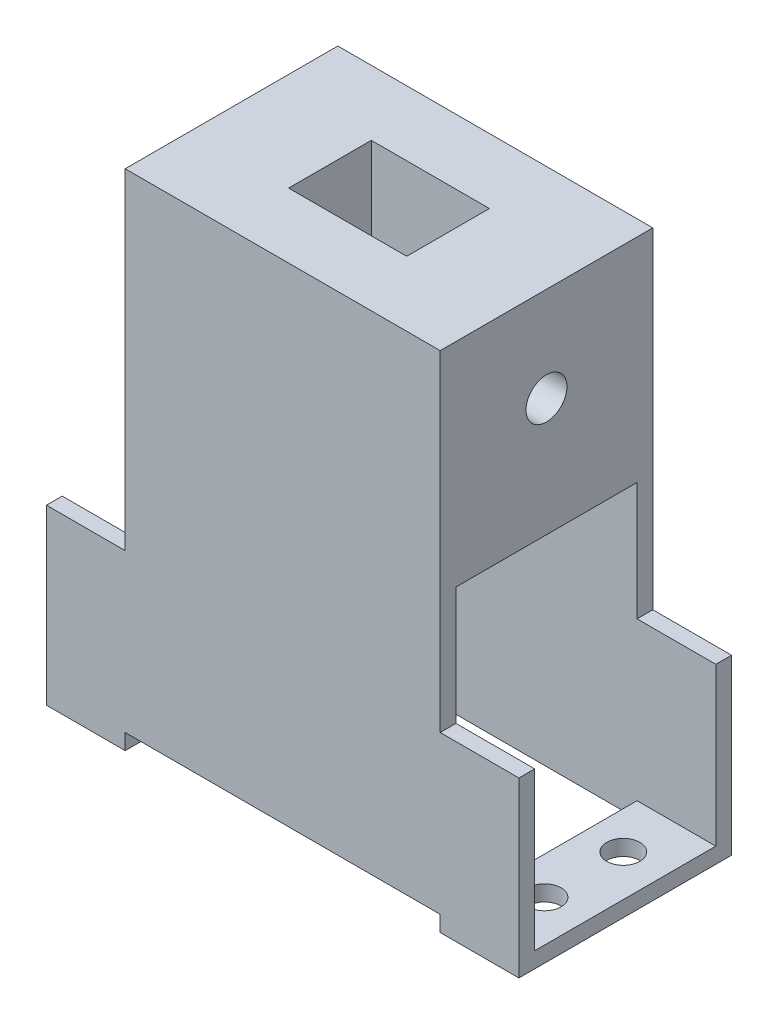
ISO-10303-21;
HEADER;
FILE_DESCRIPTION(('STEP AP214'),'2;1');
FILE_NAME('part.step','',(''),(''),'','','');
FILE_SCHEMA(('AUTOMOTIVE_DESIGN { 1 0 10303 214 1 1 1 1 }'));
ENDSEC;
DATA;
#1=APPLICATION_CONTEXT('core data for automotive mechanical design processes');
#2=APPLICATION_PROTOCOL_DEFINITION('international standard','automotive_design',2000,#1);
#3=PRODUCT_CONTEXT('',#1,'mechanical');
#4=PRODUCT('Part','Part','',(#3));
#5=PRODUCT_RELATED_PRODUCT_CATEGORY('part','',(#4));
#6=PRODUCT_DEFINITION_FORMATION('','',#4);
#7=PRODUCT_DEFINITION_CONTEXT('part definition',#1,'design');
#8=PRODUCT_DEFINITION('design','',#6,#7);
#9=PRODUCT_DEFINITION_SHAPE('','',#8);
#10=(LENGTH_UNIT() NAMED_UNIT(*) SI_UNIT(.MILLI.,.METRE.));
#11=(NAMED_UNIT(*) PLANE_ANGLE_UNIT() SI_UNIT($,.RADIAN.));
#12=(NAMED_UNIT(*) SI_UNIT($,.STERADIAN.) SOLID_ANGLE_UNIT());
#13=UNCERTAINTY_MEASURE_WITH_UNIT(LENGTH_MEASURE(1.E-05),#10,'distance_accuracy_value','');
#14=(GEOMETRIC_REPRESENTATION_CONTEXT(3) GLOBAL_UNCERTAINTY_ASSIGNED_CONTEXT((#13)) GLOBAL_UNIT_ASSIGNED_CONTEXT((#10,
#11,#12)) REPRESENTATION_CONTEXT('',''));
#15=CARTESIAN_POINT('',(0.,0.,0.));
#16=DIRECTION('',(0.,0.,1.));
#17=DIRECTION('',(1.,0.,0.));
#18=AXIS2_PLACEMENT_3D('',#15,#16,#17);
#19=CARTESIAN_POINT('',(30.001,32.5,-11.5));
#20=DIRECTION('',(-1.,0.,0.));
#21=DIRECTION('',(0.,0.,1.));
#22=AXIS2_PLACEMENT_3D('',#19,#20,#21);
#23=CYLINDRICAL_SURFACE('',#22,2.6);
#24=CARTESIAN_POINT('',(7.5,32.5,-11.5));
#25=DIRECTION('',(1.,0.,0.));
#26=DIRECTION('',(0.,0.,-1.));
#27=AXIS2_PLACEMENT_3D('',#24,#25,#26);
#28=CIRCLE('',#27,2.6);
#29=CARTESIAN_POINT('',(7.5,32.5,-14.1));
#30=VERTEX_POINT('',#29);
#31=EDGE_CURVE('E47',#30,#30,#28,.F.);
#32=ORIENTED_EDGE('',*,*,#31,.T.);
#33=EDGE_LOOP('',(#32));
#34=FACE_BOUND('',#33,.T.);
#35=CARTESIAN_POINT('',(20.,32.5,-11.5));
#36=DIRECTION('',(-1.,0.,0.));
#37=DIRECTION('',(0.,-1.,0.));
#38=AXIS2_PLACEMENT_3D('',#35,#36,#37);
#39=CIRCLE('',#38,2.6);
#40=CARTESIAN_POINT('',(20.,29.9,-11.5));
#41=VERTEX_POINT('',#40);
#42=EDGE_CURVE('E257',#41,#41,#39,.F.);
#43=ORIENTED_EDGE('',*,*,#42,.T.);
#44=EDGE_LOOP('',(#43));
#45=FACE_BOUND('',#44,.T.);
#46=ADVANCED_FACE('F43',(#34,#45),#23,.F.);
#47=CARTESIAN_POINT('',(0.,-17.5,2.));
#48=DIRECTION('',(0.,-1.,0.));
#49=DIRECTION('',(0.,0.,-1.));
#50=AXIS2_PLACEMENT_3D('',#47,#48,#49);
#51=PLANE('',#50);
#52=DIRECTION('',(-1.,0.,0.));
#53=VECTOR('',#52,1.);
#54=CARTESIAN_POINT('',(0.,-17.5,0.));
#55=LINE('',#54,#53);
#56=CARTESIAN_POINT('',(20.,-17.5,0.));
#57=VERTEX_POINT('',#56);
#58=CARTESIAN_POINT('',(-20.,-17.5,0.));
#59=VERTEX_POINT('',#58);
#60=EDGE_CURVE('E420',#57,#59,#55,.T.);
#61=ORIENTED_EDGE('',*,*,#60,.F.);
#62=DIRECTION('',(0.,0.,-1.));
#63=VECTOR('',#62,1.);
#64=CARTESIAN_POINT('',(20.,-17.5,2.));
#65=LINE('',#64,#63);
#66=CARTESIAN_POINT('',(20.,-17.5,2.));
#67=VERTEX_POINT('',#66);
#68=EDGE_CURVE('E69',#67,#57,#65,.T.);
#69=ORIENTED_EDGE('',*,*,#68,.F.);
#70=DIRECTION('',(-1.,0.,0.));
#71=VECTOR('',#70,1.);
#72=CARTESIAN_POINT('',(0.,-17.5,2.));
#73=LINE('',#72,#71);
#74=CARTESIAN_POINT('',(-20.,-17.5,2.));
#75=VERTEX_POINT('',#74);
#76=EDGE_CURVE('E398',#67,#75,#73,.T.);
#77=ORIENTED_EDGE('',*,*,#76,.T.);
#78=DIRECTION('',(0.,0.,1.));
#79=VECTOR('',#78,1.);
#80=CARTESIAN_POINT('',(-20.,-17.5,-23.));
#81=LINE('',#80,#79);
#82=EDGE_CURVE('E11',#59,#75,#81,.T.);
#83=ORIENTED_EDGE('',*,*,#82,.F.);
#84=EDGE_LOOP('',(#61,#69,#77,#83));
#85=FACE_BOUND('',#84,.T.);
#86=ADVANCED_FACE('F461',(#85),#51,.T.);
#87=CARTESIAN_POINT('',(0.,2.5,2.));
#88=DIRECTION('',(0.,1.,0.));
#89=DIRECTION('',(-1.,0.,0.));
#90=AXIS2_PLACEMENT_3D('',#87,#88,#89);
#91=PLANE('',#90);
#92=DIRECTION('',(1.,0.,0.));
#93=VECTOR('',#92,1.);
#94=CARTESIAN_POINT('',(0.,2.5,0.));
#95=LINE('',#94,#93);
#96=CARTESIAN_POINT('',(-30.,2.5,0.));
#97=VERTEX_POINT('',#96);
#98=CARTESIAN_POINT('',(-20.,2.5,0.));
#99=VERTEX_POINT('',#98);
#100=EDGE_CURVE('E390',#97,#99,#95,.T.);
#101=ORIENTED_EDGE('',*,*,#100,.F.);
#102=DIRECTION('',(0.,0.,-1.));
#103=VECTOR('',#102,1.);
#104=CARTESIAN_POINT('',(-30.,2.5,2.));
#105=LINE('',#104,#103);
#106=CARTESIAN_POINT('',(-30.,2.5,2.));
#107=VERTEX_POINT('',#106);
#108=EDGE_CURVE('E52',#107,#97,#105,.T.);
#109=ORIENTED_EDGE('',*,*,#108,.F.);
#110=DIRECTION('',(1.,0.,0.));
#111=VECTOR('',#110,1.);
#112=CARTESIAN_POINT('',(0.,2.5,2.));
#113=LINE('',#112,#111);
#114=CARTESIAN_POINT('',(-20.,2.5,2.));
#115=VERTEX_POINT('',#114);
#116=EDGE_CURVE('E391',#107,#115,#113,.T.);
#117=ORIENTED_EDGE('',*,*,#116,.T.);
#118=DIRECTION('',(0.,0.,-1.));
#119=VECTOR('',#118,1.);
#120=CARTESIAN_POINT('',(-20.,2.5,2.));
#121=LINE('',#120,#119);
#122=EDGE_CURVE('E409',#115,#99,#121,.T.);
#123=ORIENTED_EDGE('',*,*,#122,.T.);
#124=EDGE_LOOP('',(#101,#109,#117,#123));
#125=FACE_BOUND('',#124,.T.);
#126=ADVANCED_FACE('F45',(#125),#91,.T.);
#127=CARTESIAN_POINT('',(-30.,0.,2.));
#128=DIRECTION('',(-1.,0.,0.));
#129=DIRECTION('',(0.,0.,1.));
#130=AXIS2_PLACEMENT_3D('',#127,#128,#129);
#131=PLANE('',#130);
#132=DIRECTION('',(0.,1.,0.));
#133=VECTOR('',#132,1.);
#134=CARTESIAN_POINT('',(-30.,0.,0.));
#135=LINE('',#134,#133);
#136=CARTESIAN_POINT('',(-30.,-17.5,0.));
#137=VERTEX_POINT('',#136);
#138=EDGE_CURVE('E412',#137,#97,#135,.T.);
#139=ORIENTED_EDGE('',*,*,#138,.F.);
#140=DIRECTION('',(0.,0.,-1.));
#141=VECTOR('',#140,1.);
#142=CARTESIAN_POINT('',(-30.,-17.5,2.));
#143=LINE('',#142,#141);
#144=CARTESIAN_POINT('',(-30.,-17.5,-23.));
#145=VERTEX_POINT('',#144);
#146=EDGE_CURVE('E365',#137,#145,#143,.T.);
#147=ORIENTED_EDGE('',*,*,#146,.T.);
#148=DIRECTION('',(0.,1.,0.));
#149=VECTOR('',#148,1.);
#150=CARTESIAN_POINT('',(-30.,-19.5,-23.));
#151=LINE('',#150,#149);
#152=CARTESIAN_POINT('',(-30.,2.5,-23.));
#153=VERTEX_POINT('',#152);
#154=EDGE_CURVE('E307',#145,#153,#151,.T.);
#155=ORIENTED_EDGE('',*,*,#154,.T.);
#156=DIRECTION('',(0.,0.,1.));
#157=VECTOR('',#156,1.);
#158=CARTESIAN_POINT('',(-30.,2.5,-25.));
#159=LINE('',#158,#157);
#160=CARTESIAN_POINT('',(-30.,2.5,-25.));
#161=VERTEX_POINT('',#160);
#162=EDGE_CURVE('E348',#161,#153,#159,.T.);
#163=ORIENTED_EDGE('',*,*,#162,.F.);
#164=DIRECTION('',(0.,1.,0.));
#165=VECTOR('',#164,1.);
#166=CARTESIAN_POINT('',(-30.,-17.5,-25.));
#167=LINE('',#166,#165);
#168=CARTESIAN_POINT('',(-30.,-19.5,-25.));
#169=VERTEX_POINT('',#168);
#170=EDGE_CURVE('E303',#169,#161,#167,.T.);
#171=ORIENTED_EDGE('',*,*,#170,.F.);
#172=DIRECTION('',(0.,0.,-1.));
#173=VECTOR('',#172,1.);
#174=CARTESIAN_POINT('',(-30.,-19.5,2.));
#175=LINE('',#174,#173);
#176=CARTESIAN_POINT('',(-30.,-19.5,2.));
#177=VERTEX_POINT('',#176);
#178=EDGE_CURVE('E375',#177,#169,#175,.T.);
#179=ORIENTED_EDGE('',*,*,#178,.F.);
#180=DIRECTION('',(0.,1.,0.));
#181=VECTOR('',#180,1.);
#182=CARTESIAN_POINT('',(-30.,0.,2.));
#183=LINE('',#182,#181);
#184=EDGE_CURVE('E394',#177,#107,#183,.T.);
#185=ORIENTED_EDGE('',*,*,#184,.T.);
#186=ORIENTED_EDGE('',*,*,#108,.T.);
#187=EDGE_LOOP('',(#139,#147,#155,#163,#171,#179,#185,#186));
#188=FACE_BOUND('',#187,.T.);
#189=ADVANCED_FACE('F548',(#188),#131,.T.);
#190=CARTESIAN_POINT('',(30.,0.,2.));
#191=DIRECTION('',(1.,0.,0.));
#192=DIRECTION('',(0.,1.,0.));
#193=AXIS2_PLACEMENT_3D('',#190,#191,#192);
#194=PLANE('',#193);
#195=DIRECTION('',(0.,-1.,0.));
#196=VECTOR('',#195,1.);
#197=CARTESIAN_POINT('',(30.,0.,0.));
#198=LINE('',#197,#196);
#199=CARTESIAN_POINT('',(30.,2.50000000000001,0.));
#200=VERTEX_POINT('',#199);
#201=CARTESIAN_POINT('',(30.,-17.5,0.));
#202=VERTEX_POINT('',#201);
#203=EDGE_CURVE('E419',#200,#202,#198,.T.);
#204=ORIENTED_EDGE('',*,*,#203,.F.);
#205=DIRECTION('',(0.,0.,-1.));
#206=VECTOR('',#205,1.);
#207=CARTESIAN_POINT('',(30.,2.50000000000001,2.));
#208=LINE('',#207,#206);
#209=CARTESIAN_POINT('',(30.,2.50000000000001,2.));
#210=VERTEX_POINT('',#209);
#211=EDGE_CURVE('E437',#210,#200,#208,.T.);
#212=ORIENTED_EDGE('',*,*,#211,.F.);
#213=DIRECTION('',(0.,-1.,0.));
#214=VECTOR('',#213,1.);
#215=CARTESIAN_POINT('',(30.,0.,2.));
#216=LINE('',#215,#214);
#217=CARTESIAN_POINT('',(30.,-19.5,2.));
#218=VERTEX_POINT('',#217);
#219=EDGE_CURVE('E400',#210,#218,#216,.T.);
#220=ORIENTED_EDGE('',*,*,#219,.T.);
#221=DIRECTION('',(0.,0.,1.));
#222=VECTOR('',#221,1.);
#223=CARTESIAN_POINT('',(30.,-19.5,-23.));
#224=LINE('',#223,#222);
#225=CARTESIAN_POINT('',(30.,-19.5,-25.));
#226=VERTEX_POINT('',#225);
#227=EDGE_CURVE('E369',#226,#218,#224,.T.);
#228=ORIENTED_EDGE('',*,*,#227,.F.);
#229=DIRECTION('',(0.,-1.,0.));
#230=VECTOR('',#229,1.);
#231=CARTESIAN_POINT('',(30.,2.50000000000001,-25.));
#232=LINE('',#231,#230);
#233=CARTESIAN_POINT('',(30.,2.50000000000001,-25.));
#234=VERTEX_POINT('',#233);
#235=EDGE_CURVE('E315',#234,#226,#232,.T.);
#236=ORIENTED_EDGE('',*,*,#235,.F.);
#237=DIRECTION('',(0.,0.,1.));
#238=VECTOR('',#237,1.);
#239=CARTESIAN_POINT('',(30.,2.50000000000001,-25.));
#240=LINE('',#239,#238);
#241=CARTESIAN_POINT('',(30.,2.50000000000001,-23.));
#242=VERTEX_POINT('',#241);
#243=EDGE_CURVE('E321',#234,#242,#240,.T.);
#244=ORIENTED_EDGE('',*,*,#243,.T.);
#245=DIRECTION('',(0.,-1.,0.));
#246=VECTOR('',#245,1.);
#247=CARTESIAN_POINT('',(30.,-19.5,-23.));
#248=LINE('',#247,#246);
#249=CARTESIAN_POINT('',(30.,-17.5,-23.));
#250=VERTEX_POINT('',#249);
#251=EDGE_CURVE('E333',#242,#250,#248,.T.);
#252=ORIENTED_EDGE('',*,*,#251,.T.);
#253=DIRECTION('',(0.,0.,1.));
#254=VECTOR('',#253,1.);
#255=CARTESIAN_POINT('',(30.,-17.5,-23.));
#256=LINE('',#255,#254);
#257=EDGE_CURVE('E358',#250,#202,#256,.T.);
#258=ORIENTED_EDGE('',*,*,#257,.T.);
#259=EDGE_LOOP('',(#204,#212,#220,#228,#236,#244,#252,#258));
#260=FACE_BOUND('',#259,.T.);
#261=ADVANCED_FACE('F545',(#260),#194,.T.);
#262=CARTESIAN_POINT('',(0.,2.5,2.));
#263=DIRECTION('',(0.,1.,0.));
#264=DIRECTION('',(-1.,0.,0.));
#265=AXIS2_PLACEMENT_3D('',#262,#263,#264);
#266=PLANE('',#265);
#267=DIRECTION('',(1.,0.,0.));
#268=VECTOR('',#267,1.);
#269=CARTESIAN_POINT('',(0.,2.5,0.));
#270=LINE('',#269,#268);
#271=CARTESIAN_POINT('',(20.,2.5,0.));
#272=VERTEX_POINT('',#271);
#273=EDGE_CURVE('E423',#272,#200,#270,.T.);
#274=ORIENTED_EDGE('',*,*,#273,.F.);
#275=DIRECTION('',(0.,0.,-1.));
#276=VECTOR('',#275,1.);
#277=CARTESIAN_POINT('',(20.,2.5,2.));
#278=LINE('',#277,#276);
#279=CARTESIAN_POINT('',(20.,2.5,2.));
#280=VERTEX_POINT('',#279);
#281=EDGE_CURVE('E435',#280,#272,#278,.T.);
#282=ORIENTED_EDGE('',*,*,#281,.F.);
#283=DIRECTION('',(1.,0.,0.));
#284=VECTOR('',#283,1.);
#285=CARTESIAN_POINT('',(0.,2.5,2.));
#286=LINE('',#285,#284);
#287=EDGE_CURVE('E402',#280,#210,#286,.T.);
#288=ORIENTED_EDGE('',*,*,#287,.T.);
#289=ORIENTED_EDGE('',*,*,#211,.T.);
#290=EDGE_LOOP('',(#274,#282,#288,#289));
#291=FACE_BOUND('',#290,.T.);
#292=ADVANCED_FACE('F541',(#291),#266,.T.);
#293=CARTESIAN_POINT('',(20.,0.,2.));
#294=DIRECTION('',(-1.,0.,0.));
#295=DIRECTION('',(0.,-1.,0.));
#296=AXIS2_PLACEMENT_3D('',#293,#294,#295);
#297=PLANE('',#296);
#298=ORIENTED_EDGE('',*,*,#42,.F.);
#299=EDGE_LOOP('',(#298));
#300=FACE_BOUND('',#299,.T.);
#301=DIRECTION('',(0.,1.,0.));
#302=VECTOR('',#301,1.);
#303=CARTESIAN_POINT('',(20.,0.,0.));
#304=LINE('',#303,#302);
#305=CARTESIAN_POINT('',(20.,17.5,0.));
#306=VERTEX_POINT('',#305);
#307=EDGE_CURVE('E426',#272,#306,#304,.T.);
#308=ORIENTED_EDGE('',*,*,#307,.T.);
#309=DIRECTION('',(0.,0.,-1.));
#310=VECTOR('',#309,1.);
#311=CARTESIAN_POINT('',(20.,17.5,2.));
#312=LINE('',#311,#310);
#313=CARTESIAN_POINT('',(20.,17.5,-23.));
#314=VERTEX_POINT('',#313);
#315=EDGE_CURVE('E275',#306,#314,#312,.T.);
#316=ORIENTED_EDGE('',*,*,#315,.T.);
#317=DIRECTION('',(0.,-1.,0.));
#318=VECTOR('',#317,1.);
#319=CARTESIAN_POINT('',(20.,17.5,-23.));
#320=LINE('',#319,#318);
#321=CARTESIAN_POINT('',(20.,2.5,-23.));
#322=VERTEX_POINT('',#321);
#323=EDGE_CURVE('E328',#314,#322,#320,.T.);
#324=ORIENTED_EDGE('',*,*,#323,.T.);
#325=DIRECTION('',(0.,0.,1.));
#326=VECTOR('',#325,1.);
#327=CARTESIAN_POINT('',(20.,2.5,-25.));
#328=LINE('',#327,#326);
#329=CARTESIAN_POINT('',(20.,2.5,-25.));
#330=VERTEX_POINT('',#329);
#331=EDGE_CURVE('E342',#330,#322,#328,.T.);
#332=ORIENTED_EDGE('',*,*,#331,.F.);
#333=DIRECTION('',(0.,-1.,0.));
#334=VECTOR('',#333,1.);
#335=CARTESIAN_POINT('',(20.,17.5,-25.));
#336=LINE('',#335,#334);
#337=CARTESIAN_POINT('',(20.,44.5,-25.));
#338=VERTEX_POINT('',#337);
#339=EDGE_CURVE('E311',#338,#330,#336,.T.);
#340=ORIENTED_EDGE('',*,*,#339,.F.);
#341=DIRECTION('',(0.,0.,-1.));
#342=VECTOR('',#341,1.);
#343=CARTESIAN_POINT('',(20.,44.5,2.));
#344=LINE('',#343,#342);
#345=CARTESIAN_POINT('',(20.,44.5,2.));
#346=VERTEX_POINT('',#345);
#347=EDGE_CURVE('E263',#346,#338,#344,.T.);
#348=ORIENTED_EDGE('',*,*,#347,.F.);
#349=DIRECTION('',(0.,1.,0.));
#350=VECTOR('',#349,1.);
#351=CARTESIAN_POINT('',(20.,0.,2.));
#352=LINE('',#351,#350);
#353=EDGE_CURVE('E405',#280,#346,#352,.T.);
#354=ORIENTED_EDGE('',*,*,#353,.F.);
#355=ORIENTED_EDGE('',*,*,#281,.T.);
#356=EDGE_LOOP('',(#308,#316,#324,#332,#340,#348,#354,#355));
#357=FACE_BOUND('',#356,.T.);
#358=ADVANCED_FACE('F537',(#300,#357),#297,.F.);
#359=CARTESIAN_POINT('',(-20.,0.,2.));
#360=DIRECTION('',(-1.,0.,0.));
#361=DIRECTION('',(0.,0.,1.));
#362=AXIS2_PLACEMENT_3D('',#359,#360,#361);
#363=PLANE('',#362);
#364=CARTESIAN_POINT('',(-20.,32.5,-11.5));
#365=DIRECTION('',(-1.,0.,0.));
#366=DIRECTION('',(0.,0.,1.));
#367=AXIS2_PLACEMENT_3D('',#364,#365,#366);
#368=CIRCLE('',#367,2.6);
#369=CARTESIAN_POINT('',(-20.,32.5,-8.90000000000001));
#370=VERTEX_POINT('',#369);
#371=EDGE_CURVE('E254',#370,#370,#368,.T.);
#372=ORIENTED_EDGE('',*,*,#371,.F.);
#373=EDGE_LOOP('',(#372));
#374=FACE_BOUND('',#373,.T.);
#375=DIRECTION('',(0.,1.,0.));
#376=VECTOR('',#375,1.);
#377=CARTESIAN_POINT('',(-20.,0.,0.));
#378=LINE('',#377,#376);
#379=CARTESIAN_POINT('',(-20.,17.5,0.));
#380=VERTEX_POINT('',#379);
#381=EDGE_CURVE('E395',#99,#380,#378,.T.);
#382=ORIENTED_EDGE('',*,*,#381,.F.);
#383=ORIENTED_EDGE('',*,*,#122,.F.);
#384=DIRECTION('',(0.,1.,0.));
#385=VECTOR('',#384,1.);
#386=CARTESIAN_POINT('',(-20.,0.,2.));
#387=LINE('',#386,#385);
#388=CARTESIAN_POINT('',(-20.,44.5,2.));
#389=VERTEX_POINT('',#388);
#390=EDGE_CURVE('E407',#115,#389,#387,.T.);
#391=ORIENTED_EDGE('',*,*,#390,.T.);
#392=DIRECTION('',(0.,0.,1.));
#393=VECTOR('',#392,1.);
#394=CARTESIAN_POINT('',(-20.,44.5,-25.));
#395=LINE('',#394,#393);
#396=CARTESIAN_POINT('',(-20.,44.5,-25.));
#397=VERTEX_POINT('',#396);
#398=EDGE_CURVE('E269',#397,#389,#395,.T.);
#399=ORIENTED_EDGE('',*,*,#398,.F.);
#400=DIRECTION('',(0.,1.,0.));
#401=VECTOR('',#400,1.);
#402=CARTESIAN_POINT('',(-20.,2.5,-25.));
#403=LINE('',#402,#401);
#404=CARTESIAN_POINT('',(-20.,2.5,-25.));
#405=VERTEX_POINT('',#404);
#406=EDGE_CURVE('E309',#405,#397,#403,.T.);
#407=ORIENTED_EDGE('',*,*,#406,.F.);
#408=DIRECTION('',(0.,0.,1.));
#409=VECTOR('',#408,1.);
#410=CARTESIAN_POINT('',(-20.,2.5,-25.));
#411=LINE('',#410,#409);
#412=CARTESIAN_POINT('',(-20.,2.5,-23.));
#413=VERTEX_POINT('',#412);
#414=EDGE_CURVE('E345',#405,#413,#411,.T.);
#415=ORIENTED_EDGE('',*,*,#414,.T.);
#416=DIRECTION('',(0.,1.,0.));
#417=VECTOR('',#416,1.);
#418=CARTESIAN_POINT('',(-20.,2.5,-23.));
#419=LINE('',#418,#417);
#420=CARTESIAN_POINT('',(-20.,17.5,-23.));
#421=VERTEX_POINT('',#420);
#422=EDGE_CURVE('E323',#413,#421,#419,.T.);
#423=ORIENTED_EDGE('',*,*,#422,.T.);
#424=DIRECTION('',(0.,0.,1.));
#425=VECTOR('',#424,1.);
#426=CARTESIAN_POINT('',(-20.,17.5,0.));
#427=LINE('',#426,#425);
#428=EDGE_CURVE('E272',#421,#380,#427,.T.);
#429=ORIENTED_EDGE('',*,*,#428,.T.);
#430=EDGE_LOOP('',(#382,#383,#391,#399,#407,#415,#423,#429));
#431=FACE_BOUND('',#430,.T.);
#432=ADVANCED_FACE('F530',(#374,#431),#363,.T.);
#433=CARTESIAN_POINT('',(0.,0.,2.));
#434=DIRECTION('',(0.,0.,1.));
#435=DIRECTION('',(1.,0.,0.));
#436=AXIS2_PLACEMENT_3D('',#433,#434,#435);
#437=PLANE('',#436);
#438=ORIENTED_EDGE('',*,*,#116,.F.);
#439=ORIENTED_EDGE('',*,*,#184,.F.);
#440=DIRECTION('',(-1.,0.,0.));
#441=VECTOR('',#440,1.);
#442=CARTESIAN_POINT('',(-20.,-19.5,2.));
#443=LINE('',#442,#441);
#444=CARTESIAN_POINT('',(-20.,-19.5,2.));
#445=VERTEX_POINT('',#444);
#446=EDGE_CURVE('E372',#445,#177,#443,.T.);
#447=ORIENTED_EDGE('',*,*,#446,.F.);
#448=DIRECTION('',(0.,1.,0.));
#449=VECTOR('',#448,1.);
#450=CARTESIAN_POINT('',(-20.,-19.5,2.));
#451=LINE('',#450,#449);
#452=EDGE_CURVE('E379',#445,#75,#451,.T.);
#453=ORIENTED_EDGE('',*,*,#452,.T.);
#454=ORIENTED_EDGE('',*,*,#76,.F.);
#455=DIRECTION('',(0.,1.,0.));
#456=VECTOR('',#455,1.);
#457=CARTESIAN_POINT('',(20.,-19.5,2.));
#458=LINE('',#457,#456);
#459=CARTESIAN_POINT('',(20.,-19.5,2.));
#460=VERTEX_POINT('',#459);
#461=EDGE_CURVE('E351',#460,#67,#458,.T.);
#462=ORIENTED_EDGE('',*,*,#461,.F.);
#463=DIRECTION('',(-1.,0.,0.));
#464=VECTOR('',#463,1.);
#465=CARTESIAN_POINT('',(30.,-19.5,2.));
#466=LINE('',#465,#464);
#467=EDGE_CURVE('E367',#218,#460,#466,.T.);
#468=ORIENTED_EDGE('',*,*,#467,.F.);
#469=ORIENTED_EDGE('',*,*,#219,.F.);
#470=ORIENTED_EDGE('',*,*,#287,.F.);
#471=ORIENTED_EDGE('',*,*,#353,.T.);
#472=DIRECTION('',(1.,0.,0.));
#473=VECTOR('',#472,1.);
#474=CARTESIAN_POINT('',(-20.,44.5,2.));
#475=LINE('',#474,#473);
#476=EDGE_CURVE('E260',#389,#346,#475,.T.);
#477=ORIENTED_EDGE('',*,*,#476,.F.);
#478=ORIENTED_EDGE('',*,*,#390,.F.);
#479=EDGE_LOOP('',(#438,#439,#447,#453,#454,#462,#468,#469,#470,#471,#477,#478));
#480=FACE_BOUND('',#479,.T.);
#481=ADVANCED_FACE('F527',(#480),#437,.T.);
#482=CARTESIAN_POINT('',(0.,0.,0.));
#483=DIRECTION('',(0.,0.,1.));
#484=DIRECTION('',(1.,0.,0.));
#485=AXIS2_PLACEMENT_3D('',#482,#483,#484);
#486=PLANE('',#485);
#487=ORIENTED_EDGE('',*,*,#100,.T.);
#488=ORIENTED_EDGE('',*,*,#381,.T.);
#489=DIRECTION('',(1.,0.,0.));
#490=VECTOR('',#489,1.);
#491=CARTESIAN_POINT('',(0.,17.5,0.));
#492=LINE('',#491,#490);
#493=EDGE_CURVE('E429',#380,#306,#492,.T.);
#494=ORIENTED_EDGE('',*,*,#493,.T.);
#495=ORIENTED_EDGE('',*,*,#307,.F.);
#496=ORIENTED_EDGE('',*,*,#273,.T.);
#497=ORIENTED_EDGE('',*,*,#203,.T.);
#498=EDGE_CURVE('E416',#202,#57,#55,.T.);
#499=ORIENTED_EDGE('',*,*,#498,.T.);
#500=ORIENTED_EDGE('',*,*,#60,.T.);
#501=EDGE_CURVE('E415',#59,#137,#55,.T.);
#502=ORIENTED_EDGE('',*,*,#501,.T.);
#503=ORIENTED_EDGE('',*,*,#138,.T.);
#504=EDGE_LOOP('',(#487,#488,#494,#495,#496,#497,#499,#500,#502,#503));
#505=FACE_BOUND('',#504,.T.);
#506=ADVANCED_FACE('F525',(#505),#486,.F.);
#507=CARTESIAN_POINT('',(-20.,-19.5,-23.));
#508=DIRECTION('',(-1.,0.,0.));
#509=DIRECTION('',(0.,-1.,0.));
#510=AXIS2_PLACEMENT_3D('',#507,#508,#509);
#511=PLANE('',#510);
#512=CARTESIAN_POINT('',(-20.,-17.5,-23.));
#513=VERTEX_POINT('',#512);
#514=EDGE_CURVE('E54',#513,#59,#81,.T.);
#515=ORIENTED_EDGE('',*,*,#514,.T.);
#516=ORIENTED_EDGE('',*,*,#82,.T.);
#517=ORIENTED_EDGE('',*,*,#452,.F.);
#518=DIRECTION('',(0.,0.,1.));
#519=VECTOR('',#518,1.);
#520=CARTESIAN_POINT('',(-20.,-19.5,-23.));
#521=LINE('',#520,#519);
#522=CARTESIAN_POINT('',(-20.,-19.5,-23.));
#523=VERTEX_POINT('',#522);
#524=EDGE_CURVE('E377',#523,#445,#521,.T.);
#525=ORIENTED_EDGE('',*,*,#524,.F.);
#526=DIRECTION('',(0.,1.,0.));
#527=VECTOR('',#526,1.);
#528=CARTESIAN_POINT('',(-20.,-19.5,-23.));
#529=LINE('',#528,#527);
#530=EDGE_CURVE('E387',#523,#513,#529,.T.);
#531=ORIENTED_EDGE('',*,*,#530,.T.);
#532=EDGE_LOOP('',(#515,#516,#517,#525,#531));
#533=FACE_BOUND('',#532,.T.);
#534=ADVANCED_FACE('F518',(#533),#511,.F.);
#535=CARTESIAN_POINT('',(0.,-19.5,0.));
#536=DIRECTION('',(0.,-1.,0.));
#537=DIRECTION('',(1.,0.,0.));
#538=AXIS2_PLACEMENT_3D('',#535,#536,#537);
#539=PLANE('',#538);
#540=CARTESIAN_POINT('',(24.75,-19.5,-6.5));
#541=DIRECTION('',(0.,-1.,0.));
#542=DIRECTION('',(1.,0.,0.));
#543=AXIS2_PLACEMENT_3D('',#540,#541,#542);
#544=CIRCLE('',#543,2.1);
#545=CARTESIAN_POINT('',(26.85,-19.5,-6.5));
#546=VERTEX_POINT('',#545);
#547=EDGE_CURVE('E285',#546,#546,#544,.F.);
#548=ORIENTED_EDGE('',*,*,#547,.T.);
#549=EDGE_LOOP('',(#548));
#550=FACE_BOUND('',#549,.T.);
#551=CARTESIAN_POINT('',(-24.75,-19.5,-16.5));
#552=DIRECTION('',(0.,-1.,0.));
#553=DIRECTION('',(1.,0.,0.));
#554=AXIS2_PLACEMENT_3D('',#551,#552,#553);
#555=CIRCLE('',#554,2.1);
#556=CARTESIAN_POINT('',(-22.65,-19.5,-16.5));
#557=VERTEX_POINT('',#556);
#558=EDGE_CURVE('E292',#557,#557,#555,.F.);
#559=ORIENTED_EDGE('',*,*,#558,.T.);
#560=EDGE_LOOP('',(#559));
#561=FACE_BOUND('',#560,.T.);
#562=CARTESIAN_POINT('',(-24.75,-19.5,-6.49999999999999));
#563=DIRECTION('',(0.,-1.,0.));
#564=DIRECTION('',(1.,0.,0.));
#565=AXIS2_PLACEMENT_3D('',#562,#563,#564);
#566=CIRCLE('',#565,2.1);
#567=CARTESIAN_POINT('',(-22.65,-19.5,-6.49999999999999));
#568=VERTEX_POINT('',#567);
#569=EDGE_CURVE('E279',#568,#568,#566,.F.);
#570=ORIENTED_EDGE('',*,*,#569,.T.);
#571=EDGE_LOOP('',(#570));
#572=FACE_BOUND('',#571,.T.);
#573=CARTESIAN_POINT('',(24.75,-19.5,-16.5));
#574=DIRECTION('',(0.,-1.,0.));
#575=DIRECTION('',(1.,0.,0.));
#576=AXIS2_PLACEMENT_3D('',#573,#574,#575);
#577=CIRCLE('',#576,2.1);
#578=CARTESIAN_POINT('',(26.85,-19.5,-16.5));
#579=VERTEX_POINT('',#578);
#580=EDGE_CURVE('E288',#579,#579,#577,.F.);
#581=ORIENTED_EDGE('',*,*,#580,.T.);
#582=EDGE_LOOP('',(#581));
#583=FACE_BOUND('',#582,.T.);
#584=ORIENTED_EDGE('',*,*,#446,.T.);
#585=ORIENTED_EDGE('',*,*,#178,.T.);
#586=DIRECTION('',(-1.,0.,0.));
#587=VECTOR('',#586,1.);
#588=CARTESIAN_POINT('',(30.,-19.5,-25.));
#589=LINE('',#588,#587);
#590=EDGE_CURVE('E318',#226,#169,#589,.T.);
#591=ORIENTED_EDGE('',*,*,#590,.F.);
#592=ORIENTED_EDGE('',*,*,#227,.T.);
#593=ORIENTED_EDGE('',*,*,#467,.T.);
#594=DIRECTION('',(0.,0.,-1.));
#595=VECTOR('',#594,1.);
#596=CARTESIAN_POINT('',(20.,-19.5,2.));
#597=LINE('',#596,#595);
#598=CARTESIAN_POINT('',(20.,-19.5,-23.));
#599=VERTEX_POINT('',#598);
#600=EDGE_CURVE('E356',#460,#599,#597,.T.);
#601=ORIENTED_EDGE('',*,*,#600,.T.);
#602=DIRECTION('',(-1.,0.,0.));
#603=VECTOR('',#602,1.);
#604=CARTESIAN_POINT('',(30.,-19.5,-23.));
#605=LINE('',#604,#603);
#606=EDGE_CURVE('E336',#599,#523,#605,.T.);
#607=ORIENTED_EDGE('',*,*,#606,.T.);
#608=ORIENTED_EDGE('',*,*,#524,.T.);
#609=EDGE_LOOP('',(#584,#585,#591,#592,#593,#601,#607,#608));
#610=FACE_BOUND('',#609,.T.);
#611=ADVANCED_FACE('F515',(#550,#561,#572,#583,#610),#539,.T.);
#612=CARTESIAN_POINT('',(0.,-17.5,0.));
#613=DIRECTION('',(0.,-1.,0.));
#614=DIRECTION('',(1.,0.,0.));
#615=AXIS2_PLACEMENT_3D('',#612,#613,#614);
#616=PLANE('',#615);
#617=CARTESIAN_POINT('',(-24.75,-17.5,-16.5));
#618=DIRECTION('',(0.,1.,0.));
#619=DIRECTION('',(-1.,0.,0.));
#620=AXIS2_PLACEMENT_3D('',#617,#618,#619);
#621=CIRCLE('',#620,2.1);
#622=CARTESIAN_POINT('',(-26.85,-17.5,-16.5));
#623=VERTEX_POINT('',#622);
#624=EDGE_CURVE('E282',#623,#623,#621,.T.);
#625=ORIENTED_EDGE('',*,*,#624,.F.);
#626=EDGE_LOOP('',(#625));
#627=FACE_BOUND('',#626,.T.);
#628=CARTESIAN_POINT('',(-24.75,-17.5,-6.49999999999999));
#629=DIRECTION('',(0.,1.,0.));
#630=DIRECTION('',(-1.,0.,0.));
#631=AXIS2_PLACEMENT_3D('',#628,#629,#630);
#632=CIRCLE('',#631,2.1);
#633=CARTESIAN_POINT('',(-26.85,-17.5,-6.49999999999999));
#634=VERTEX_POINT('',#633);
#635=EDGE_CURVE('E278',#634,#634,#632,.T.);
#636=ORIENTED_EDGE('',*,*,#635,.F.);
#637=EDGE_LOOP('',(#636));
#638=FACE_BOUND('',#637,.T.);
#639=ORIENTED_EDGE('',*,*,#501,.F.);
#640=ORIENTED_EDGE('',*,*,#514,.F.);
#641=DIRECTION('',(1.,0.,0.));
#642=VECTOR('',#641,1.);
#643=CARTESIAN_POINT('',(-30.,-17.5,-23.));
#644=LINE('',#643,#642);
#645=EDGE_CURVE('E382',#145,#513,#644,.T.);
#646=ORIENTED_EDGE('',*,*,#645,.F.);
#647=ORIENTED_EDGE('',*,*,#146,.F.);
#648=EDGE_LOOP('',(#639,#640,#646,#647));
#649=FACE_BOUND('',#648,.T.);
#650=ADVANCED_FACE('F513',(#627,#638,#649),#616,.F.);
#651=CARTESIAN_POINT('',(0.,-17.5,0.));
#652=DIRECTION('',(0.,-1.,0.));
#653=DIRECTION('',(1.,0.,0.));
#654=AXIS2_PLACEMENT_3D('',#651,#652,#653);
#655=PLANE('',#654);
#656=CARTESIAN_POINT('',(24.75,-17.5,-6.5));
#657=DIRECTION('',(0.,1.,0.));
#658=DIRECTION('',(-1.,0.,0.));
#659=AXIS2_PLACEMENT_3D('',#656,#657,#658);
#660=CIRCLE('',#659,2.1);
#661=CARTESIAN_POINT('',(22.65,-17.5,-6.5));
#662=VERTEX_POINT('',#661);
#663=EDGE_CURVE('E289',#662,#662,#660,.T.);
#664=ORIENTED_EDGE('',*,*,#663,.F.);
#665=EDGE_LOOP('',(#664));
#666=FACE_BOUND('',#665,.T.);
#667=CARTESIAN_POINT('',(24.75,-17.5,-16.5));
#668=DIRECTION('',(0.,1.,0.));
#669=DIRECTION('',(-1.,0.,0.));
#670=AXIS2_PLACEMENT_3D('',#667,#668,#669);
#671=CIRCLE('',#670,2.1);
#672=CARTESIAN_POINT('',(22.65,-17.5,-16.5));
#673=VERTEX_POINT('',#672);
#674=EDGE_CURVE('E297',#673,#673,#671,.T.);
#675=ORIENTED_EDGE('',*,*,#674,.F.);
#676=EDGE_LOOP('',(#675));
#677=FACE_BOUND('',#676,.T.);
#678=CARTESIAN_POINT('',(20.,-17.5,-23.));
#679=VERTEX_POINT('',#678);
#680=EDGE_CURVE('E359',#57,#679,#65,.T.);
#681=ORIENTED_EDGE('',*,*,#680,.F.);
#682=ORIENTED_EDGE('',*,*,#498,.F.);
#683=ORIENTED_EDGE('',*,*,#257,.F.);
#684=DIRECTION('',(1.,0.,0.));
#685=VECTOR('',#684,1.);
#686=CARTESIAN_POINT('',(20.,-17.5,-23.));
#687=LINE('',#686,#685);
#688=EDGE_CURVE('E362',#679,#250,#687,.T.);
#689=ORIENTED_EDGE('',*,*,#688,.F.);
#690=EDGE_LOOP('',(#681,#682,#683,#689));
#691=FACE_BOUND('',#690,.T.);
#692=ADVANCED_FACE('F510',(#666,#677,#691),#655,.F.);
#693=CARTESIAN_POINT('',(20.,-19.5,2.));
#694=DIRECTION('',(1.,0.,0.));
#695=DIRECTION('',(0.,1.,0.));
#696=AXIS2_PLACEMENT_3D('',#693,#694,#695);
#697=PLANE('',#696);
#698=ORIENTED_EDGE('',*,*,#68,.T.);
#699=ORIENTED_EDGE('',*,*,#680,.T.);
#700=DIRECTION('',(0.,1.,0.));
#701=VECTOR('',#700,1.);
#702=CARTESIAN_POINT('',(20.,-19.5,-23.));
#703=LINE('',#702,#701);
#704=EDGE_CURVE('E353',#599,#679,#703,.T.);
#705=ORIENTED_EDGE('',*,*,#704,.F.);
#706=ORIENTED_EDGE('',*,*,#600,.F.);
#707=ORIENTED_EDGE('',*,*,#461,.T.);
#708=EDGE_LOOP('',(#698,#699,#705,#706,#707));
#709=FACE_BOUND('',#708,.T.);
#710=ADVANCED_FACE('F500',(#709),#697,.F.);
#711=CARTESIAN_POINT('',(0.,0.,-23.));
#712=DIRECTION('',(0.,0.,-1.));
#713=DIRECTION('',(-1.,0.,0.));
#714=AXIS2_PLACEMENT_3D('',#711,#712,#713);
#715=PLANE('',#714);
#716=ORIENTED_EDGE('',*,*,#154,.F.);
#717=ORIENTED_EDGE('',*,*,#645,.T.);
#718=ORIENTED_EDGE('',*,*,#530,.F.);
#719=ORIENTED_EDGE('',*,*,#606,.F.);
#720=ORIENTED_EDGE('',*,*,#704,.T.);
#721=ORIENTED_EDGE('',*,*,#688,.T.);
#722=ORIENTED_EDGE('',*,*,#251,.F.);
#723=DIRECTION('',(1.,0.,0.));
#724=VECTOR('',#723,1.);
#725=CARTESIAN_POINT('',(20.,2.5,-23.));
#726=LINE('',#725,#724);
#727=EDGE_CURVE('E330',#322,#242,#726,.T.);
#728=ORIENTED_EDGE('',*,*,#727,.F.);
#729=ORIENTED_EDGE('',*,*,#323,.F.);
#730=DIRECTION('',(1.,0.,0.));
#731=VECTOR('',#730,1.);
#732=CARTESIAN_POINT('',(-20.,17.5,-23.));
#733=LINE('',#732,#731);
#734=EDGE_CURVE('E325',#421,#314,#733,.T.);
#735=ORIENTED_EDGE('',*,*,#734,.F.);
#736=ORIENTED_EDGE('',*,*,#422,.F.);
#737=DIRECTION('',(1.,0.,0.));
#738=VECTOR('',#737,1.);
#739=CARTESIAN_POINT('',(-30.,2.5,-23.));
#740=LINE('',#739,#738);
#741=EDGE_CURVE('E300',#153,#413,#740,.T.);
#742=ORIENTED_EDGE('',*,*,#741,.F.);
#743=EDGE_LOOP('',(#716,#717,#718,#719,#720,#721,#722,#728,#729,#735,#736,#742));
#744=FACE_BOUND('',#743,.T.);
#745=ADVANCED_FACE('F496',(#744),#715,.F.);
#746=CARTESIAN_POINT('',(-30.,2.5,-25.));
#747=DIRECTION('',(0.,-1.,0.));
#748=DIRECTION('',(0.,0.,-1.));
#749=AXIS2_PLACEMENT_3D('',#746,#747,#748);
#750=PLANE('',#749);
#751=ORIENTED_EDGE('',*,*,#741,.T.);
#752=ORIENTED_EDGE('',*,*,#414,.F.);
#753=DIRECTION('',(1.,0.,0.));
#754=VECTOR('',#753,1.);
#755=CARTESIAN_POINT('',(-30.,2.5,-25.));
#756=LINE('',#755,#754);
#757=EDGE_CURVE('E306',#161,#405,#756,.T.);
#758=ORIENTED_EDGE('',*,*,#757,.F.);
#759=ORIENTED_EDGE('',*,*,#162,.T.);
#760=EDGE_LOOP('',(#751,#752,#758,#759));
#761=FACE_BOUND('',#760,.T.);
#762=ADVANCED_FACE('F499',(#761),#750,.F.);
#763=CARTESIAN_POINT('',(20.,2.5,-25.));
#764=DIRECTION('',(0.,-1.,0.));
#765=DIRECTION('',(1.,0.,0.));
#766=AXIS2_PLACEMENT_3D('',#763,#764,#765);
#767=PLANE('',#766);
#768=ORIENTED_EDGE('',*,*,#727,.T.);
#769=ORIENTED_EDGE('',*,*,#243,.F.);
#770=DIRECTION('',(1.,0.,0.));
#771=VECTOR('',#770,1.);
#772=CARTESIAN_POINT('',(20.,2.5,-25.));
#773=LINE('',#772,#771);
#774=EDGE_CURVE('E313',#330,#234,#773,.T.);
#775=ORIENTED_EDGE('',*,*,#774,.F.);
#776=ORIENTED_EDGE('',*,*,#331,.T.);
#777=EDGE_LOOP('',(#768,#769,#775,#776));
#778=FACE_BOUND('',#777,.T.);
#779=ADVANCED_FACE('F494',(#778),#767,.F.);
#780=CARTESIAN_POINT('',(0.,0.,-25.));
#781=DIRECTION('',(0.,0.,-1.));
#782=DIRECTION('',(-1.,0.,0.));
#783=AXIS2_PLACEMENT_3D('',#780,#781,#782);
#784=PLANE('',#783);
#785=ORIENTED_EDGE('',*,*,#170,.T.);
#786=ORIENTED_EDGE('',*,*,#757,.T.);
#787=ORIENTED_EDGE('',*,*,#406,.T.);
#788=DIRECTION('',(-1.,0.,0.));
#789=VECTOR('',#788,1.);
#790=CARTESIAN_POINT('',(20.,44.5,-25.));
#791=LINE('',#790,#789);
#792=EDGE_CURVE('E266',#338,#397,#791,.T.);
#793=ORIENTED_EDGE('',*,*,#792,.F.);
#794=ORIENTED_EDGE('',*,*,#339,.T.);
#795=ORIENTED_EDGE('',*,*,#774,.T.);
#796=ORIENTED_EDGE('',*,*,#235,.T.);
#797=ORIENTED_EDGE('',*,*,#590,.T.);
#798=EDGE_LOOP('',(#785,#786,#787,#793,#794,#795,#796,#797));
#799=FACE_BOUND('',#798,.T.);
#800=ADVANCED_FACE('F490',(#799),#784,.T.);
#801=CARTESIAN_POINT('',(24.75,-19.501,-16.5));
#802=DIRECTION('',(0.,1.,0.));
#803=DIRECTION('',(-1.,0.,0.));
#804=AXIS2_PLACEMENT_3D('',#801,#802,#803);
#805=CYLINDRICAL_SURFACE('',#804,2.1);
#806=ORIENTED_EDGE('',*,*,#580,.F.);
#807=EDGE_LOOP('',(#806));
#808=FACE_BOUND('',#807,.T.);
#809=ORIENTED_EDGE('',*,*,#674,.T.);
#810=EDGE_LOOP('',(#809));
#811=FACE_BOUND('',#810,.T.);
#812=ADVANCED_FACE('F483',(#808,#811),#805,.F.);
#813=CARTESIAN_POINT('',(24.75,-19.501,-6.5));
#814=DIRECTION('',(0.,1.,0.));
#815=DIRECTION('',(-1.,0.,0.));
#816=AXIS2_PLACEMENT_3D('',#813,#814,#815);
#817=CYLINDRICAL_SURFACE('',#816,2.1);
#818=ORIENTED_EDGE('',*,*,#547,.F.);
#819=EDGE_LOOP('',(#818));
#820=FACE_BOUND('',#819,.T.);
#821=ORIENTED_EDGE('',*,*,#663,.T.);
#822=EDGE_LOOP('',(#821));
#823=FACE_BOUND('',#822,.T.);
#824=ADVANCED_FACE('F479',(#820,#823),#817,.F.);
#825=CARTESIAN_POINT('',(-24.75,-19.501,-6.49999999999999));
#826=DIRECTION('',(0.,1.,0.));
#827=DIRECTION('',(-1.,0.,0.));
#828=AXIS2_PLACEMENT_3D('',#825,#826,#827);
#829=CYLINDRICAL_SURFACE('',#828,2.1);
#830=ORIENTED_EDGE('',*,*,#569,.F.);
#831=EDGE_LOOP('',(#830));
#832=FACE_BOUND('',#831,.T.);
#833=ORIENTED_EDGE('',*,*,#635,.T.);
#834=EDGE_LOOP('',(#833));
#835=FACE_BOUND('',#834,.T.);
#836=ADVANCED_FACE('F476',(#832,#835),#829,.F.);
#837=CARTESIAN_POINT('',(-24.75,-19.501,-16.5));
#838=DIRECTION('',(0.,1.,0.));
#839=DIRECTION('',(-1.,0.,0.));
#840=AXIS2_PLACEMENT_3D('',#837,#838,#839);
#841=CYLINDRICAL_SURFACE('',#840,2.1);
#842=ORIENTED_EDGE('',*,*,#558,.F.);
#843=EDGE_LOOP('',(#842));
#844=FACE_BOUND('',#843,.T.);
#845=ORIENTED_EDGE('',*,*,#624,.T.);
#846=EDGE_LOOP('',(#845));
#847=FACE_BOUND('',#846,.T.);
#848=ADVANCED_FACE('F474',(#844,#847),#841,.F.);
#849=CARTESIAN_POINT('',(0.,17.5,0.));
#850=DIRECTION('',(0.,1.,0.));
#851=DIRECTION('',(0.,0.,1.));
#852=AXIS2_PLACEMENT_3D('',#849,#850,#851);
#853=PLANE('',#852);
#854=ORIENTED_EDGE('',*,*,#493,.F.);
#855=ORIENTED_EDGE('',*,*,#428,.F.);
#856=ORIENTED_EDGE('',*,*,#734,.T.);
#857=ORIENTED_EDGE('',*,*,#315,.F.);
#858=EDGE_LOOP('',(#854,#855,#856,#857));
#859=FACE_BOUND('',#858,.T.);
#860=ADVANCED_FACE('F470',(#859),#853,.F.);
#861=CARTESIAN_POINT('',(0.,44.5,0.));
#862=DIRECTION('',(0.,1.,0.));
#863=DIRECTION('',(0.,0.,1.));
#864=AXIS2_PLACEMENT_3D('',#861,#862,#863);
#865=PLANE('',#864);
#866=DIRECTION('',(0.,0.,-1.));
#867=VECTOR('',#866,1.);
#868=CARTESIAN_POINT('',(7.5,44.5,-6.25));
#869=LINE('',#868,#867);
#870=CARTESIAN_POINT('',(7.5,44.5,-6.25));
#871=VERTEX_POINT('',#870);
#872=CARTESIAN_POINT('',(7.5,44.5,-16.75));
#873=VERTEX_POINT('',#872);
#874=EDGE_CURVE('E61',#871,#873,#869,.T.);
#875=ORIENTED_EDGE('',*,*,#874,.F.);
#876=DIRECTION('',(1.,0.,0.));
#877=VECTOR('',#876,1.);
#878=CARTESIAN_POINT('',(-7.5,44.5,-6.25));
#879=LINE('',#878,#877);
#880=CARTESIAN_POINT('',(-7.5,44.5,-6.25));
#881=VERTEX_POINT('',#880);
#882=EDGE_CURVE('E235',#881,#871,#879,.T.);
#883=ORIENTED_EDGE('',*,*,#882,.F.);
#884=DIRECTION('',(0.,0.,1.));
#885=VECTOR('',#884,1.);
#886=CARTESIAN_POINT('',(-7.5,44.5,-6.25));
#887=LINE('',#886,#885);
#888=CARTESIAN_POINT('',(-7.5,44.5,-16.75));
#889=VERTEX_POINT('',#888);
#890=EDGE_CURVE('E238',#889,#881,#887,.T.);
#891=ORIENTED_EDGE('',*,*,#890,.F.);
#892=DIRECTION('',(-1.,0.,0.));
#893=VECTOR('',#892,1.);
#894=CARTESIAN_POINT('',(-7.5,44.5,-16.75));
#895=LINE('',#894,#893);
#896=EDGE_CURVE('E244',#873,#889,#895,.T.);
#897=ORIENTED_EDGE('',*,*,#896,.F.);
#898=EDGE_LOOP('',(#875,#883,#891,#897));
#899=FACE_BOUND('',#898,.T.);
#900=ORIENTED_EDGE('',*,*,#476,.T.);
#901=ORIENTED_EDGE('',*,*,#347,.T.);
#902=ORIENTED_EDGE('',*,*,#792,.T.);
#903=ORIENTED_EDGE('',*,*,#398,.T.);
#904=EDGE_LOOP('',(#900,#901,#902,#903));
#905=FACE_BOUND('',#904,.T.);
#906=ADVANCED_FACE('F457',(#899,#905),#865,.T.);
#907=CARTESIAN_POINT('',(-7.5,32.5,-11.5));
#908=DIRECTION('',(-1.,0.,0.));
#909=DIRECTION('',(0.,0.,1.));
#910=AXIS2_PLACEMENT_3D('',#907,#908,#909);
#911=CIRCLE('',#910,2.6);
#912=CARTESIAN_POINT('',(-7.5,32.5,-8.90000000000001));
#913=VERTEX_POINT('',#912);
#914=EDGE_CURVE('E250',#913,#913,#911,.F.);
#915=ORIENTED_EDGE('',*,*,#914,.T.);
#916=EDGE_LOOP('',(#915));
#917=FACE_BOUND('',#916,.T.);
#918=ORIENTED_EDGE('',*,*,#371,.T.);
#919=EDGE_LOOP('',(#918));
#920=FACE_BOUND('',#919,.T.);
#921=ADVANCED_FACE('F448',(#917,#920),#23,.F.);
#922=CARTESIAN_POINT('',(7.5,22.3,-6.25));
#923=DIRECTION('',(1.,0.,0.));
#924=DIRECTION('',(0.,0.,-1.));
#925=AXIS2_PLACEMENT_3D('',#922,#923,#924);
#926=PLANE('',#925);
#927=ORIENTED_EDGE('',*,*,#874,.T.);
#928=DIRECTION('',(0.,1.,0.));
#929=VECTOR('',#928,1.);
#930=CARTESIAN_POINT('',(7.5,22.3,-16.75));
#931=LINE('',#930,#929);
#932=CARTESIAN_POINT('',(7.5,22.3,-16.75));
#933=VERTEX_POINT('',#932);
#934=EDGE_CURVE('E212',#933,#873,#931,.T.);
#935=ORIENTED_EDGE('',*,*,#934,.F.);
#936=DIRECTION('',(0.,0.,-1.));
#937=VECTOR('',#936,1.);
#938=CARTESIAN_POINT('',(7.5,22.3,-6.25));
#939=LINE('',#938,#937);
#940=CARTESIAN_POINT('',(7.5,22.3,-6.25));
#941=VERTEX_POINT('',#940);
#942=EDGE_CURVE('E217',#941,#933,#939,.T.);
#943=ORIENTED_EDGE('',*,*,#942,.F.);
#944=DIRECTION('',(0.,1.,0.));
#945=VECTOR('',#944,1.);
#946=CARTESIAN_POINT('',(7.5,22.3,-6.25));
#947=LINE('',#946,#945);
#948=EDGE_CURVE('E248',#941,#871,#947,.T.);
#949=ORIENTED_EDGE('',*,*,#948,.T.);
#950=EDGE_LOOP('',(#927,#935,#943,#949));
#951=FACE_BOUND('',#950,.T.);
#952=ORIENTED_EDGE('',*,*,#31,.F.);
#953=EDGE_LOOP('',(#952));
#954=FACE_BOUND('',#953,.T.);
#955=ADVANCED_FACE('F214',(#951,#954),#926,.F.);
#956=CARTESIAN_POINT('',(-7.5,22.3,-6.25));
#957=DIRECTION('',(-1.,0.,0.));
#958=DIRECTION('',(0.,0.,1.));
#959=AXIS2_PLACEMENT_3D('',#956,#957,#958);
#960=PLANE('',#959);
#961=ORIENTED_EDGE('',*,*,#890,.T.);
#962=DIRECTION('',(0.,1.,0.));
#963=VECTOR('',#962,1.);
#964=CARTESIAN_POINT('',(-7.5,22.3,-6.25));
#965=LINE('',#964,#963);
#966=CARTESIAN_POINT('',(-7.5,22.3,-6.25));
#967=VERTEX_POINT('',#966);
#968=EDGE_CURVE('E251',#967,#881,#965,.T.);
#969=ORIENTED_EDGE('',*,*,#968,.F.);
#970=DIRECTION('',(0.,0.,1.));
#971=VECTOR('',#970,1.);
#972=CARTESIAN_POINT('',(-7.5,22.3,-6.25));
#973=LINE('',#972,#971);
#974=CARTESIAN_POINT('',(-7.5,22.3,-16.75));
#975=VERTEX_POINT('',#974);
#976=EDGE_CURVE('E231',#975,#967,#973,.T.);
#977=ORIENTED_EDGE('',*,*,#976,.F.);
#978=DIRECTION('',(0.,1.,0.));
#979=VECTOR('',#978,1.);
#980=CARTESIAN_POINT('',(-7.5,22.3,-16.75));
#981=LINE('',#980,#979);
#982=EDGE_CURVE('E222',#975,#889,#981,.T.);
#983=ORIENTED_EDGE('',*,*,#982,.T.);
#984=EDGE_LOOP('',(#961,#969,#977,#983));
#985=FACE_BOUND('',#984,.T.);
#986=ORIENTED_EDGE('',*,*,#914,.F.);
#987=EDGE_LOOP('',(#986));
#988=FACE_BOUND('',#987,.T.);
#989=ADVANCED_FACE('F447',(#985,#988),#960,.F.);
#990=CARTESIAN_POINT('',(-7.5,22.3,-6.25));
#991=DIRECTION('',(0.,0.,1.));
#992=DIRECTION('',(1.,0.,0.));
#993=AXIS2_PLACEMENT_3D('',#990,#991,#992);
#994=PLANE('',#993);
#995=ORIENTED_EDGE('',*,*,#882,.T.);
#996=ORIENTED_EDGE('',*,*,#948,.F.);
#997=DIRECTION('',(1.,0.,0.));
#998=VECTOR('',#997,1.);
#999=CARTESIAN_POINT('',(-7.5,22.3,-6.25));
#1000=LINE('',#999,#998);
#1001=EDGE_CURVE('E223',#967,#941,#1000,.T.);
#1002=ORIENTED_EDGE('',*,*,#1001,.F.);
#1003=ORIENTED_EDGE('',*,*,#968,.T.);
#1004=EDGE_LOOP('',(#995,#996,#1002,#1003));
#1005=FACE_BOUND('',#1004,.T.);
#1006=ADVANCED_FACE('F454',(#1005),#994,.F.);
#1007=CARTESIAN_POINT('',(-7.5,22.3,-16.75));
#1008=DIRECTION('',(0.,0.,-1.));
#1009=DIRECTION('',(-1.,0.,0.));
#1010=AXIS2_PLACEMENT_3D('',#1007,#1008,#1009);
#1011=PLANE('',#1010);
#1012=ORIENTED_EDGE('',*,*,#896,.T.);
#1013=ORIENTED_EDGE('',*,*,#982,.F.);
#1014=DIRECTION('',(-1.,0.,0.));
#1015=VECTOR('',#1014,1.);
#1016=CARTESIAN_POINT('',(-7.5,22.3,-16.75));
#1017=LINE('',#1016,#1015);
#1018=EDGE_CURVE('E226',#933,#975,#1017,.T.);
#1019=ORIENTED_EDGE('',*,*,#1018,.F.);
#1020=ORIENTED_EDGE('',*,*,#934,.T.);
#1021=EDGE_LOOP('',(#1012,#1013,#1019,#1020));
#1022=FACE_BOUND('',#1021,.T.);
#1023=ADVANCED_FACE('F227',(#1022),#1011,.F.);
#1024=CARTESIAN_POINT('',(0.,22.3,0.));
#1025=DIRECTION('',(0.,-1.,0.));
#1026=DIRECTION('',(0.,0.,-1.));
#1027=AXIS2_PLACEMENT_3D('',#1024,#1025,#1026);
#1028=PLANE('',#1027);
#1029=ORIENTED_EDGE('',*,*,#942,.T.);
#1030=ORIENTED_EDGE('',*,*,#1018,.T.);
#1031=ORIENTED_EDGE('',*,*,#976,.T.);
#1032=ORIENTED_EDGE('',*,*,#1001,.T.);
#1033=EDGE_LOOP('',(#1029,#1030,#1031,#1032));
#1034=FACE_BOUND('',#1033,.T.);
#1035=ADVANCED_FACE('F233',(#1034),#1028,.F.);
#1036=CLOSED_SHELL('',(#46,#86,#126,#189,#261,#292,#358,#432,#481,#506,#534,#611,#650,#692,#710,
#745,#762,#779,#800,#812,#824,#836,#848,#860,#906,#921,#955,#989,#1006,#1023,#1035));
#1037=MANIFOLD_SOLID_BREP('B2',#1036);
#1038=ADVANCED_BREP_SHAPE_REPRESENTATION('',(#18,#1037),#14);
#1039=SHAPE_DEFINITION_REPRESENTATION(#9,#1038);
ENDSEC;
END-ISO-10303-21;
